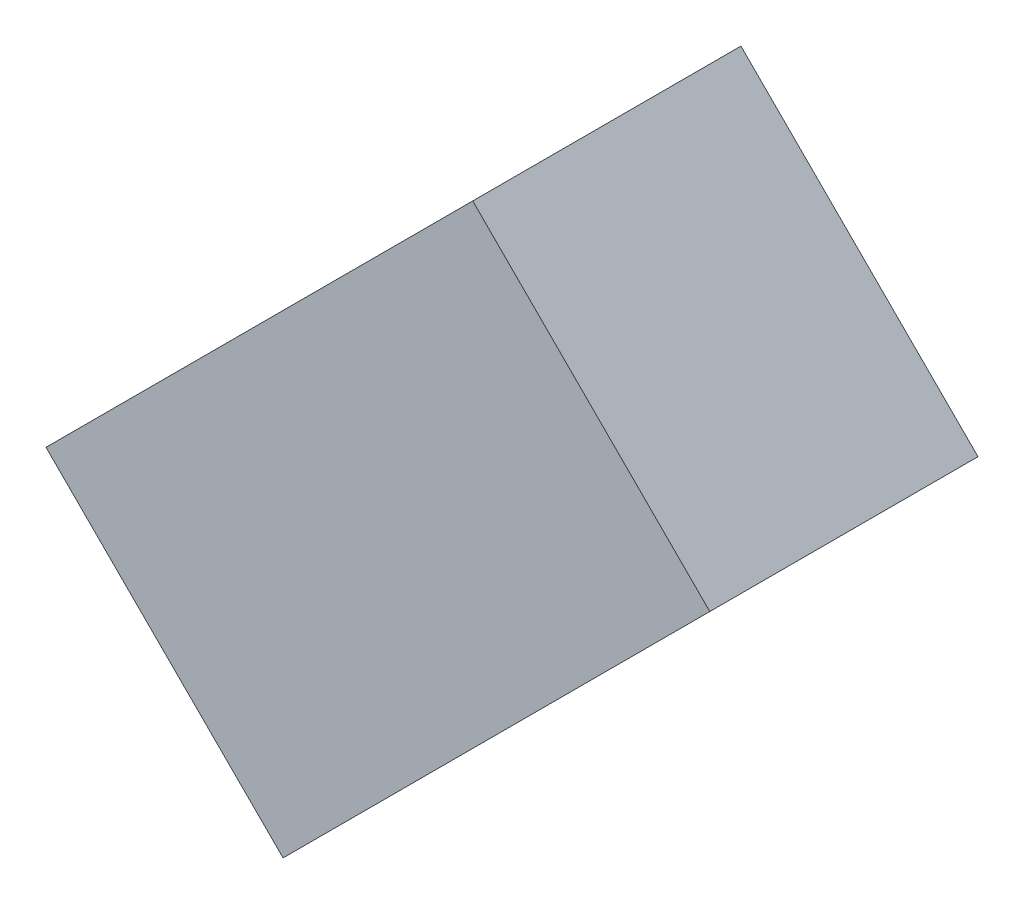
ISO-10303-21;
HEADER;
FILE_DESCRIPTION(('STEP AP214'),'2;1');
FILE_NAME('part.step','',(''),(''),'','','');
FILE_SCHEMA(('AUTOMOTIVE_DESIGN { 1 0 10303 214 1 1 1 1 }'));
ENDSEC;
DATA;
#1=APPLICATION_CONTEXT('core data for automotive mechanical design processes');
#2=APPLICATION_PROTOCOL_DEFINITION('international standard','automotive_design',2000,#1);
#3=PRODUCT_CONTEXT('',#1,'mechanical');
#4=PRODUCT('Part','Part','',(#3));
#5=PRODUCT_RELATED_PRODUCT_CATEGORY('part','',(#4));
#6=PRODUCT_DEFINITION_FORMATION('','',#4);
#7=PRODUCT_DEFINITION_CONTEXT('part definition',#1,'design');
#8=PRODUCT_DEFINITION('design','',#6,#7);
#9=PRODUCT_DEFINITION_SHAPE('','',#8);
#10=(LENGTH_UNIT() NAMED_UNIT(*) SI_UNIT(.MILLI.,.METRE.));
#11=(NAMED_UNIT(*) PLANE_ANGLE_UNIT() SI_UNIT($,.RADIAN.));
#12=(NAMED_UNIT(*) SI_UNIT($,.STERADIAN.) SOLID_ANGLE_UNIT());
#13=UNCERTAINTY_MEASURE_WITH_UNIT(LENGTH_MEASURE(1.E-05),#10,'distance_accuracy_value','');
#14=(GEOMETRIC_REPRESENTATION_CONTEXT(3) GLOBAL_UNCERTAINTY_ASSIGNED_CONTEXT((#13)) GLOBAL_UNIT_ASSIGNED_CONTEXT((#10,
#11,#12)) REPRESENTATION_CONTEXT('',''));
#15=CARTESIAN_POINT('',(0.,0.,0.));
#16=DIRECTION('',(0.,0.,1.));
#17=DIRECTION('',(1.,0.,0.));
#18=AXIS2_PLACEMENT_3D('',#15,#16,#17);
#19=CARTESIAN_POINT('',(100.8939949954,23.644474784888,0.45));
#20=DIRECTION('',(0.,0.,1.));
#21=DIRECTION('',(1.,0.,0.));
#22=AXIS2_PLACEMENT_3D('',#19,#20,#21);
#23=PLANE('',#22);
#24=DIRECTION('',(-0.707106781186548,0.707106781186548,0.));
#25=VECTOR('',#24,1.);
#26=CARTESIAN_POINT('',(100.8939949954,23.644474784888,0.45));
#27=LINE('',#26,#25);
#28=CARTESIAN_POINT('',(100.8939949954,23.644474784888,0.45));
#29=VERTEX_POINT('',#28);
#30=CARTESIAN_POINT('',(100.54044160481,23.998028175481,0.45));
#31=VERTEX_POINT('',#30);
#32=EDGE_CURVE('E98',#29,#31,#27,.T.);
#33=ORIENTED_EDGE('',*,*,#32,.F.);
#34=DIRECTION('',(0.707106781186548,0.707106781186548,0.));
#35=VECTOR('',#34,1.);
#36=CARTESIAN_POINT('',(100.8939949954,23.644474784888,0.45));
#37=LINE('',#36,#35);
#38=CARTESIAN_POINT('',(101.53039109847,24.280870887956,0.45));
#39=VERTEX_POINT('',#38);
#40=EDGE_CURVE('E79',#29,#39,#37,.T.);
#41=ORIENTED_EDGE('',*,*,#40,.T.);
#42=DIRECTION('',(-0.707106781186548,0.707106781186548,0.));
#43=VECTOR('',#42,1.);
#44=CARTESIAN_POINT('',(101.53039109847,24.280870887956,0.45));
#45=LINE('',#44,#43);
#46=CARTESIAN_POINT('',(101.17683770787,24.634424278549,0.45));
#47=VERTEX_POINT('',#46);
#48=EDGE_CURVE('E101',#39,#47,#45,.T.);
#49=ORIENTED_EDGE('',*,*,#48,.T.);
#50=DIRECTION('',(0.707106781186548,0.707106781186548,0.));
#51=VECTOR('',#50,1.);
#52=CARTESIAN_POINT('',(100.54044160481,23.998028175481,0.45));
#53=LINE('',#52,#51);
#54=EDGE_CURVE('E11',#31,#47,#53,.T.);
#55=ORIENTED_EDGE('',*,*,#54,.F.);
#56=EDGE_LOOP('',(#33,#41,#49,#55));
#57=FACE_BOUND('',#56,.T.);
#58=ADVANCED_FACE('F16',(#57),#23,.T.);
#59=CARTESIAN_POINT('',(100.8939949954,23.644474784888,0.05));
#60=DIRECTION('',(0.,0.,1.));
#61=DIRECTION('',(1.,0.,0.));
#62=AXIS2_PLACEMENT_3D('',#59,#60,#61);
#63=PLANE('',#62);
#64=DIRECTION('',(0.707106781186548,0.707106781186548,0.));
#65=VECTOR('',#64,1.);
#66=CARTESIAN_POINT('',(100.54044160481,23.998028175481,0.05));
#67=LINE('',#66,#65);
#68=CARTESIAN_POINT('',(100.54044160481,23.998028175481,0.05));
#69=VERTEX_POINT('',#68);
#70=CARTESIAN_POINT('',(101.17683770787,24.634424278549,0.05));
#71=VERTEX_POINT('',#70);
#72=EDGE_CURVE('E20',#69,#71,#67,.T.);
#73=ORIENTED_EDGE('',*,*,#72,.T.);
#74=DIRECTION('',(-0.707106781186548,0.707106781186548,0.));
#75=VECTOR('',#74,1.);
#76=CARTESIAN_POINT('',(101.53039109847,24.280870887956,0.05));
#77=LINE('',#76,#75);
#78=CARTESIAN_POINT('',(101.53039109847,24.280870887956,0.05));
#79=VERTEX_POINT('',#78);
#80=EDGE_CURVE('E74',#79,#71,#77,.T.);
#81=ORIENTED_EDGE('',*,*,#80,.F.);
#82=DIRECTION('',(0.707106781186548,0.707106781186548,0.));
#83=VECTOR('',#82,1.);
#84=CARTESIAN_POINT('',(100.8939949954,23.644474784888,0.05));
#85=LINE('',#84,#83);
#86=CARTESIAN_POINT('',(100.8939949954,23.644474784888,0.05));
#87=VERTEX_POINT('',#86);
#88=EDGE_CURVE('E67',#87,#79,#85,.T.);
#89=ORIENTED_EDGE('',*,*,#88,.F.);
#90=DIRECTION('',(-0.707106781186548,0.707106781186548,0.));
#91=VECTOR('',#90,1.);
#92=CARTESIAN_POINT('',(100.8939949954,23.644474784888,0.05));
#93=LINE('',#92,#91);
#94=EDGE_CURVE('E71',#87,#69,#93,.T.);
#95=ORIENTED_EDGE('',*,*,#94,.T.);
#96=EDGE_LOOP('',(#73,#81,#89,#95));
#97=FACE_BOUND('',#96,.T.);
#98=ADVANCED_FACE('F69',(#97),#63,.F.);
#99=CARTESIAN_POINT('',(100.54044160481,23.998028175481,0.05));
#100=DIRECTION('',(-0.707106781186548,0.707106781186548,0.));
#101=DIRECTION('',(0.,0.,1.));
#102=AXIS2_PLACEMENT_3D('',#99,#100,#101);
#103=PLANE('',#102);
#104=ORIENTED_EDGE('',*,*,#72,.F.);
#105=DIRECTION('',(0.,0.,1.));
#106=VECTOR('',#105,1.);
#107=CARTESIAN_POINT('',(100.54044160481,23.998028175481,0.05));
#108=LINE('',#107,#106);
#109=EDGE_CURVE('E91',#69,#31,#108,.T.);
#110=ORIENTED_EDGE('',*,*,#109,.T.);
#111=ORIENTED_EDGE('',*,*,#54,.T.);
#112=DIRECTION('',(0.,0.,1.));
#113=VECTOR('',#112,1.);
#114=CARTESIAN_POINT('',(101.17683770787,24.634424278549,0.05));
#115=LINE('',#114,#113);
#116=EDGE_CURVE('E104',#71,#47,#115,.T.);
#117=ORIENTED_EDGE('',*,*,#116,.F.);
#118=EDGE_LOOP('',(#104,#110,#111,#117));
#119=FACE_BOUND('',#118,.T.);
#120=ADVANCED_FACE('F120',(#119),#103,.T.);
#121=CARTESIAN_POINT('',(100.8939949954,23.644474784888,0.05));
#122=DIRECTION('',(-0.707106781186548,0.707106781186548,0.));
#123=DIRECTION('',(0.,0.,1.));
#124=AXIS2_PLACEMENT_3D('',#121,#122,#123);
#125=PLANE('',#124);
#126=DIRECTION('',(0.,0.,1.));
#127=VECTOR('',#126,1.);
#128=CARTESIAN_POINT('',(101.53039109847,24.280870887956,0.05));
#129=LINE('',#128,#127);
#130=EDGE_CURVE('E88',#79,#39,#129,.T.);
#131=ORIENTED_EDGE('',*,*,#130,.T.);
#132=ORIENTED_EDGE('',*,*,#40,.F.);
#133=DIRECTION('',(0.,0.,1.));
#134=VECTOR('',#133,1.);
#135=CARTESIAN_POINT('',(100.8939949954,23.644474784888,0.05));
#136=LINE('',#135,#134);
#137=EDGE_CURVE('E82',#87,#29,#136,.T.);
#138=ORIENTED_EDGE('',*,*,#137,.F.);
#139=ORIENTED_EDGE('',*,*,#88,.T.);
#140=EDGE_LOOP('',(#131,#132,#138,#139));
#141=FACE_BOUND('',#140,.T.);
#142=ADVANCED_FACE('F83',(#141),#125,.F.);
#143=CARTESIAN_POINT('',(101.53039109847,24.280870887956,0.05));
#144=DIRECTION('',(0.707106781186548,0.707106781186548,0.));
#145=DIRECTION('',(0.,0.,-1.));
#146=AXIS2_PLACEMENT_3D('',#143,#144,#145);
#147=PLANE('',#146);
#148=ORIENTED_EDGE('',*,*,#130,.F.);
#149=ORIENTED_EDGE('',*,*,#80,.T.);
#150=ORIENTED_EDGE('',*,*,#116,.T.);
#151=ORIENTED_EDGE('',*,*,#48,.F.);
#152=EDGE_LOOP('',(#148,#149,#150,#151));
#153=FACE_BOUND('',#152,.T.);
#154=ADVANCED_FACE('F18',(#153),#147,.T.);
#155=CARTESIAN_POINT('',(100.8939949954,23.644474784888,0.05));
#156=DIRECTION('',(0.707106781186548,0.707106781186548,0.));
#157=DIRECTION('',(0.,0.,-1.));
#158=AXIS2_PLACEMENT_3D('',#155,#156,#157);
#159=PLANE('',#158);
#160=ORIENTED_EDGE('',*,*,#32,.T.);
#161=ORIENTED_EDGE('',*,*,#109,.F.);
#162=ORIENTED_EDGE('',*,*,#94,.F.);
#163=ORIENTED_EDGE('',*,*,#137,.T.);
#164=EDGE_LOOP('',(#160,#161,#162,#163));
#165=FACE_BOUND('',#164,.T.);
#166=ADVANCED_FACE('F90',(#165),#159,.F.);
#167=CLOSED_SHELL('',(#58,#98,#120,#142,#154,#166));
#168=MANIFOLD_SOLID_BREP('B1',#167);
#169=ADVANCED_BREP_SHAPE_REPRESENTATION('',(#18,#168),#14);
#170=SHAPE_DEFINITION_REPRESENTATION(#9,#169);
ENDSEC;
END-ISO-10303-21;
